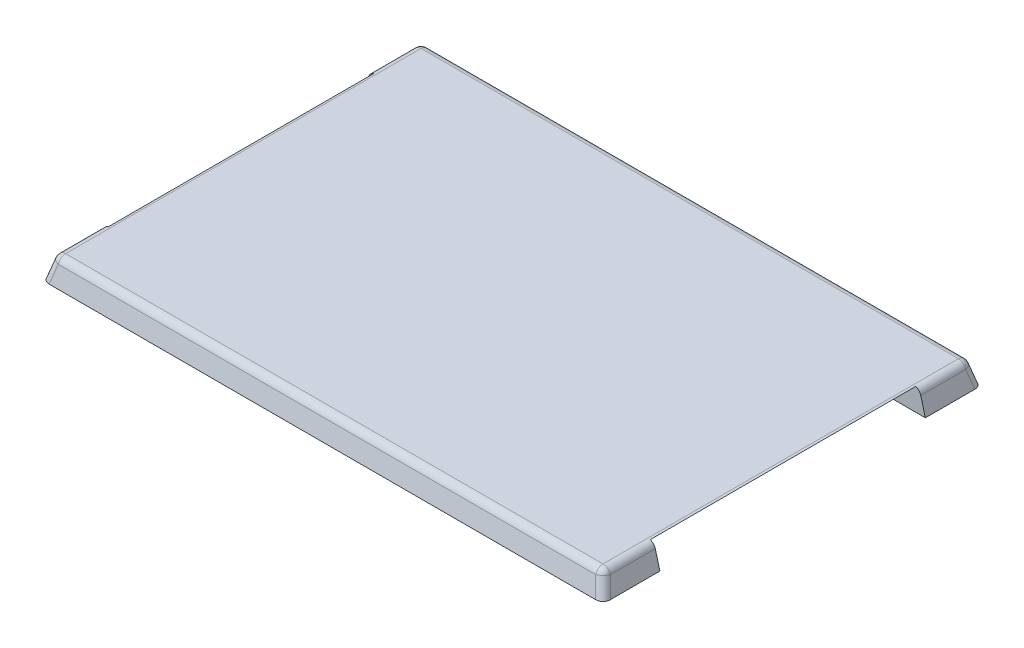
ISO-10303-21;
HEADER;
FILE_DESCRIPTION(('STEP AP214'),'2;1');
FILE_NAME('part.step','',(''),(''),'','','');
FILE_SCHEMA(('AUTOMOTIVE_DESIGN { 1 0 10303 214 1 1 1 1 }'));
ENDSEC;
DATA;
#1=APPLICATION_CONTEXT('core data for automotive mechanical design processes');
#2=APPLICATION_PROTOCOL_DEFINITION('international standard','automotive_design',2000,#1);
#3=PRODUCT_CONTEXT('',#1,'mechanical');
#4=PRODUCT('Part','Part','',(#3));
#5=PRODUCT_RELATED_PRODUCT_CATEGORY('part','',(#4));
#6=PRODUCT_DEFINITION_FORMATION('','',#4);
#7=PRODUCT_DEFINITION_CONTEXT('part definition',#1,'design');
#8=PRODUCT_DEFINITION('design','',#6,#7);
#9=PRODUCT_DEFINITION_SHAPE('','',#8);
#10=(LENGTH_UNIT() NAMED_UNIT(*) SI_UNIT(.MILLI.,.METRE.));
#11=(NAMED_UNIT(*) PLANE_ANGLE_UNIT() SI_UNIT($,.RADIAN.));
#12=(NAMED_UNIT(*) SI_UNIT($,.STERADIAN.) SOLID_ANGLE_UNIT());
#13=UNCERTAINTY_MEASURE_WITH_UNIT(LENGTH_MEASURE(1.E-05),#10,'distance_accuracy_value','');
#14=(GEOMETRIC_REPRESENTATION_CONTEXT(3) GLOBAL_UNCERTAINTY_ASSIGNED_CONTEXT((#13)) GLOBAL_UNIT_ASSIGNED_CONTEXT((#10,
#11,#12)) REPRESENTATION_CONTEXT('',''));
#15=CARTESIAN_POINT('',(0.,0.,0.));
#16=DIRECTION('',(0.,0.,1.));
#17=DIRECTION('',(1.,0.,0.));
#18=AXIS2_PLACEMENT_3D('',#15,#16,#17);
#19=CARTESIAN_POINT('',(3.5574121546408,0.105217202360702,-2.12499999999997));
#20=DIRECTION('',(0.624695047554425,-0.78086880944303,0.));
#21=DIRECTION('',(0.,0.,-1.));
#22=AXIS2_PLACEMENT_3D('',#19,#20,#21);
#23=PLANE('',#22);
#24=DIRECTION('',(0.78086880944303,0.624695047554425,0.));
#25=VECTOR('',#24,1.);
#26=CARTESIAN_POINT('',(3.5574121546408,0.105217202360702,-2.12499999999997));
#27=LINE('',#26,#25);
#28=CARTESIAN_POINT('',(3.42589065168992,0.,-2.12499999999997));
#29=VERTEX_POINT('',#28);
#30=CARTESIAN_POINT('',(3.5574121546408,0.105217202360702,-2.12499999999997));
#31=VERTEX_POINT('',#30);
#32=EDGE_CURVE('E302',#29,#31,#27,.T.);
#33=ORIENTED_EDGE('',*,*,#32,.T.);
#34=DIRECTION('',(0.,0.,1.));
#35=VECTOR('',#34,1.);
#36=CARTESIAN_POINT('',(3.5574121546408,0.105217202360702,-2.12499999999997));
#37=LINE('',#36,#35);
#38=CARTESIAN_POINT('',(3.5574121546408,0.105217202360714,-0.374999999999966));
#39=VERTEX_POINT('',#38);
#40=EDGE_CURVE('E11',#31,#39,#37,.T.);
#41=ORIENTED_EDGE('',*,*,#40,.T.);
#42=DIRECTION('',(0.78086880944303,0.624695047554425,0.));
#43=VECTOR('',#42,1.);
#44=CARTESIAN_POINT('',(3.5574121546408,0.105217202360714,-0.374999999999966));
#45=LINE('',#44,#43);
#46=CARTESIAN_POINT('',(3.4258906516899,0.,-0.374999999999965));
#47=VERTEX_POINT('',#46);
#48=EDGE_CURVE('E307',#47,#39,#45,.T.);
#49=ORIENTED_EDGE('',*,*,#48,.F.);
#50=DIRECTION('',(0.,0.,1.));
#51=VECTOR('',#50,1.);
#52=CARTESIAN_POINT('',(3.4258906516899,0.,0.));
#53=LINE('',#52,#51);
#54=EDGE_CURVE('E271',#29,#47,#53,.T.);
#55=ORIENTED_EDGE('',*,*,#54,.F.);
#56=EDGE_LOOP('',(#33,#41,#49,#55));
#57=FACE_BOUND('',#56,.T.);
#58=ADVANCED_FACE('F16',(#57),#23,.T.);
#59=CARTESIAN_POINT('',(3.7135859165294,-0.0900000000000547,-2.12499999999996));
#60=DIRECTION('',(0.,0.,1.));
#61=DIRECTION('',(-1.,0.,0.));
#62=AXIS2_PLACEMENT_3D('',#59,#60,#61);
#63=CYLINDRICAL_SURFACE('',#62,0.25);
#64=CARTESIAN_POINT('',(3.7135859165294,-0.0900000000000425,-0.374999999999965));
#65=DIRECTION('',(0.,0.,-1.));
#66=DIRECTION('',(-1.,0.,0.));
#67=AXIS2_PLACEMENT_3D('',#64,#65,#66);
#68=CIRCLE('',#67,0.25);
#69=CARTESIAN_POINT('',(3.63628006833615,0.147747357156923,-0.374999999999966));
#70=VERTEX_POINT('',#69);
#71=EDGE_CURVE('E24',#39,#70,#68,.T.);
#72=ORIENTED_EDGE('',*,*,#71,.F.);
#73=ORIENTED_EDGE('',*,*,#40,.F.);
#74=CARTESIAN_POINT('',(3.7135859165294,-0.0900000000000547,-2.12499999999996));
#75=DIRECTION('',(0.,0.,-1.));
#76=DIRECTION('',(-1.,0.,0.));
#77=AXIS2_PLACEMENT_3D('',#74,#75,#76);
#78=CIRCLE('',#77,0.25);
#79=CARTESIAN_POINT('',(3.63628006833617,0.147747357156917,-2.12499999999997));
#80=VERTEX_POINT('',#79);
#81=EDGE_CURVE('E306',#31,#80,#78,.T.);
#82=ORIENTED_EDGE('',*,*,#81,.T.);
#83=DIRECTION('',(0.,0.,-1.));
#84=VECTOR('',#83,1.);
#85=CARTESIAN_POINT('',(3.63628006833616,0.14774735715692,-1.24999999999997));
#86=LINE('',#85,#84);
#87=EDGE_CURVE('E259',#70,#80,#86,.T.);
#88=ORIENTED_EDGE('',*,*,#87,.F.);
#89=EDGE_LOOP('',(#72,#73,#82,#88));
#90=FACE_BOUND('',#89,.T.);
#91=ADVANCED_FACE('F458',(#90),#63,.F.);
#92=CARTESIAN_POINT('',(3.7135859165294,-0.0900000000000425,-0.374999999999965));
#93=DIRECTION('',(0.,0.,1.));
#94=DIRECTION('',(0.,-1.,0.));
#95=AXIS2_PLACEMENT_3D('',#92,#93,#94);
#96=PLANE('',#95);
#97=DIRECTION('',(-1.,0.,0.));
#98=VECTOR('',#97,1.);
#99=CARTESIAN_POINT('',(3.68507810593582,0.,-0.374999999999965));
#100=LINE('',#99,#98);
#101=CARTESIAN_POINT('',(3.7,0.,-0.374999999999965));
#102=VERTEX_POINT('',#101);
#103=EDGE_CURVE('E266',#102,#47,#100,.T.);
#104=ORIENTED_EDGE('',*,*,#103,.T.);
#105=ORIENTED_EDGE('',*,*,#48,.T.);
#106=ORIENTED_EDGE('',*,*,#71,.T.);
#107=CARTESIAN_POINT('',(3.62144127173638,0.1,-0.374999999999966));
#108=DIRECTION('',(0.,0.,-1.));
#109=DIRECTION('',(0.,-1.,0.));
#110=AXIS2_PLACEMENT_3D('',#107,#108,#109);
#111=CIRCLE('',#110,0.05);
#112=CARTESIAN_POINT('',(3.66973756305084,0.112940952255126,-0.374999999999966));
#113=VERTEX_POINT('',#112);
#114=EDGE_CURVE('E345',#70,#113,#111,.T.);
#115=ORIENTED_EDGE('',*,*,#114,.T.);
#116=DIRECTION('',(-0.258819045102521,0.965925826289068,0.));
#117=VECTOR('',#116,1.);
#118=CARTESIAN_POINT('',(3.7,0.,-0.374999999999965));
#119=LINE('',#118,#117);
#120=EDGE_CURVE('E361',#102,#113,#119,.T.);
#121=ORIENTED_EDGE('',*,*,#120,.F.);
#122=EDGE_LOOP('',(#104,#105,#106,#115,#121));
#123=FACE_BOUND('',#122,.T.);
#124=ADVANCED_FACE('F447',(#123),#96,.F.);
#125=CARTESIAN_POINT('',(3.7135859165294,-0.0900000000000547,-2.12499999999996));
#126=DIRECTION('',(0.,0.,1.));
#127=DIRECTION('',(0.,-1.,0.));
#128=AXIS2_PLACEMENT_3D('',#125,#126,#127);
#129=PLANE('',#128);
#130=DIRECTION('',(-1.,0.,0.));
#131=VECTOR('',#130,1.);
#132=CARTESIAN_POINT('',(3.68507810593582,0.,-2.12499999999997));
#133=LINE('',#132,#131);
#134=CARTESIAN_POINT('',(3.7,0.,-2.12499999999997));
#135=VERTEX_POINT('',#134);
#136=EDGE_CURVE('E292',#135,#29,#133,.T.);
#137=ORIENTED_EDGE('',*,*,#136,.F.);
#138=DIRECTION('',(-0.258819045102521,0.965925826289068,0.));
#139=VECTOR('',#138,1.);
#140=CARTESIAN_POINT('',(3.7,0.,-2.12499999999996));
#141=LINE('',#140,#139);
#142=CARTESIAN_POINT('',(3.66973756305084,0.112940952255126,-2.12499999999997));
#143=VERTEX_POINT('',#142);
#144=EDGE_CURVE('E253',#135,#143,#141,.T.);
#145=ORIENTED_EDGE('',*,*,#144,.T.);
#146=CARTESIAN_POINT('',(3.62144127173638,0.1,-2.12499999999997));
#147=DIRECTION('',(0.,0.,-1.));
#148=DIRECTION('',(0.,-1.,0.));
#149=AXIS2_PLACEMENT_3D('',#146,#147,#148);
#150=CIRCLE('',#149,0.05);
#151=EDGE_CURVE('E327',#80,#143,#150,.T.);
#152=ORIENTED_EDGE('',*,*,#151,.F.);
#153=ORIENTED_EDGE('',*,*,#81,.F.);
#154=ORIENTED_EDGE('',*,*,#32,.F.);
#155=EDGE_LOOP('',(#137,#145,#152,#153,#154));
#156=FACE_BOUND('',#155,.T.);
#157=ADVANCED_FACE('F454',(#156),#129,.T.);
#158=CARTESIAN_POINT('',(0.142587845359203,0.105217202360703,-2.12499999999997));
#159=DIRECTION('',(-0.624695047554425,-0.78086880944303,0.));
#160=DIRECTION('',(-0.78086880944303,0.624695047554425,0.));
#161=AXIS2_PLACEMENT_3D('',#158,#159,#160);
#162=PLANE('',#161);
#163=DIRECTION('',(0.78086880944303,-0.624695047554425,0.));
#164=VECTOR('',#163,1.);
#165=CARTESIAN_POINT('',(0.142587845359203,0.105217202360715,-0.374999999999966));
#166=LINE('',#165,#164);
#167=CARTESIAN_POINT('',(0.142587845359203,0.105217202360715,-0.374999999999966));
#168=VERTEX_POINT('',#167);
#169=CARTESIAN_POINT('',(0.274109348310097,0.,-0.374999999999965));
#170=VERTEX_POINT('',#169);
#171=EDGE_CURVE('E205',#168,#170,#166,.T.);
#172=ORIENTED_EDGE('',*,*,#171,.F.);
#173=DIRECTION('',(0.,0.,1.));
#174=VECTOR('',#173,1.);
#175=CARTESIAN_POINT('',(0.142587845359203,0.105217202360703,-2.12499999999997));
#176=LINE('',#175,#174);
#177=CARTESIAN_POINT('',(0.142587845359203,0.105217202360703,-2.12499999999997));
#178=VERTEX_POINT('',#177);
#179=EDGE_CURVE('E394',#178,#168,#176,.T.);
#180=ORIENTED_EDGE('',*,*,#179,.F.);
#181=DIRECTION('',(0.78086880944303,-0.624695047554425,0.));
#182=VECTOR('',#181,1.);
#183=CARTESIAN_POINT('',(0.142587845359203,0.105217202360703,-2.12499999999997));
#184=LINE('',#183,#182);
#185=CARTESIAN_POINT('',(0.274109348310082,0.,-2.12499999999997));
#186=VERTEX_POINT('',#185);
#187=EDGE_CURVE('E403',#178,#186,#184,.T.);
#188=ORIENTED_EDGE('',*,*,#187,.T.);
#189=DIRECTION('',(0.,0.,-1.));
#190=VECTOR('',#189,1.);
#191=CARTESIAN_POINT('',(0.2741093483101,0.,0.));
#192=LINE('',#191,#190);
#193=EDGE_CURVE('E210',#170,#186,#192,.T.);
#194=ORIENTED_EDGE('',*,*,#193,.F.);
#195=EDGE_LOOP('',(#172,#180,#188,#194));
#196=FACE_BOUND('',#195,.T.);
#197=ADVANCED_FACE('F487',(#196),#162,.T.);
#198=CARTESIAN_POINT('',(-0.0135859165294031,-0.0900000000000543,-2.12499999999996));
#199=DIRECTION('',(0.,0.,1.));
#200=DIRECTION('',(-1.,0.,0.));
#201=AXIS2_PLACEMENT_3D('',#198,#199,#200);
#202=CYLINDRICAL_SURFACE('',#201,0.25);
#203=CARTESIAN_POINT('',(-0.0135859165294031,-0.0900000000000543,-2.12499999999996));
#204=DIRECTION('',(0.,0.,-1.));
#205=DIRECTION('',(1.,0.,0.));
#206=AXIS2_PLACEMENT_3D('',#203,#204,#205);
#207=CIRCLE('',#206,0.25);
#208=CARTESIAN_POINT('',(0.0637199316638319,0.147747357156917,-2.12499999999997));
#209=VERTEX_POINT('',#208);
#210=EDGE_CURVE('E406',#209,#178,#207,.T.);
#211=ORIENTED_EDGE('',*,*,#210,.T.);
#212=ORIENTED_EDGE('',*,*,#179,.T.);
#213=CARTESIAN_POINT('',(-0.0135859165294031,-0.0900000000000421,-0.374999999999965));
#214=DIRECTION('',(0.,0.,-1.));
#215=DIRECTION('',(1.,0.,0.));
#216=AXIS2_PLACEMENT_3D('',#213,#214,#215);
#217=CIRCLE('',#216,0.25);
#218=CARTESIAN_POINT('',(0.0637199316638511,0.147747357156923,-0.374999999999966));
#219=VERTEX_POINT('',#218);
#220=EDGE_CURVE('E436',#219,#168,#217,.T.);
#221=ORIENTED_EDGE('',*,*,#220,.F.);
#222=DIRECTION('',(0.,0.,1.));
#223=VECTOR('',#222,1.);
#224=CARTESIAN_POINT('',(0.0637199316638412,0.14774735715692,-1.24999999999997));
#225=LINE('',#224,#223);
#226=EDGE_CURVE('E417',#209,#219,#225,.T.);
#227=ORIENTED_EDGE('',*,*,#226,.F.);
#228=EDGE_LOOP('',(#211,#212,#221,#227));
#229=FACE_BOUND('',#228,.T.);
#230=ADVANCED_FACE('F486',(#229),#202,.F.);
#231=CARTESIAN_POINT('',(-0.0135859165294031,-0.0900000000000421,-0.374999999999965));
#232=DIRECTION('',(0.,0.,-1.));
#233=DIRECTION('',(0.,-1.,0.));
#234=AXIS2_PLACEMENT_3D('',#231,#232,#233);
#235=PLANE('',#234);
#236=DIRECTION('',(-1.,0.,0.));
#237=VECTOR('',#236,1.);
#238=CARTESIAN_POINT('',(0.0149218940641788,0.,-0.374999999999965));
#239=LINE('',#238,#237);
#240=CARTESIAN_POINT('',(0.,0.,-0.374999999999965));
#241=VERTEX_POINT('',#240);
#242=EDGE_CURVE('E192',#170,#241,#239,.T.);
#243=ORIENTED_EDGE('',*,*,#242,.T.);
#244=DIRECTION('',(0.258819045102521,0.965925826289068,0.));
#245=VECTOR('',#244,1.);
#246=CARTESIAN_POINT('',(0.,0.,-0.374999999999965));
#247=LINE('',#246,#245);
#248=CARTESIAN_POINT('',(0.0302624369491631,0.112940952255126,-0.374999999999966));
#249=VERTEX_POINT('',#248);
#250=EDGE_CURVE('E200',#241,#249,#247,.T.);
#251=ORIENTED_EDGE('',*,*,#250,.T.);
#252=CARTESIAN_POINT('',(0.0785587282636165,0.1,-0.374999999999966));
#253=DIRECTION('',(0.,0.,1.));
#254=DIRECTION('',(0.,1.,0.));
#255=AXIS2_PLACEMENT_3D('',#252,#253,#254);
#256=CIRCLE('',#255,0.05);
#257=EDGE_CURVE('E423',#219,#249,#256,.T.);
#258=ORIENTED_EDGE('',*,*,#257,.F.);
#259=ORIENTED_EDGE('',*,*,#220,.T.);
#260=ORIENTED_EDGE('',*,*,#171,.T.);
#261=EDGE_LOOP('',(#243,#251,#258,#259,#260));
#262=FACE_BOUND('',#261,.T.);
#263=ADVANCED_FACE('F198',(#262),#235,.T.);
#264=CARTESIAN_POINT('',(-0.0135859165294031,-0.0900000000000543,-2.12499999999996));
#265=DIRECTION('',(0.,0.,-1.));
#266=DIRECTION('',(0.,-1.,0.));
#267=AXIS2_PLACEMENT_3D('',#264,#265,#266);
#268=PLANE('',#267);
#269=DIRECTION('',(1.,0.,0.));
#270=VECTOR('',#269,1.);
#271=CARTESIAN_POINT('',(0.,0.,-2.12499999999996));
#272=LINE('',#271,#270);
#273=CARTESIAN_POINT('',(0.,0.,-2.12499999999997));
#274=VERTEX_POINT('',#273);
#275=EDGE_CURVE('E280',#274,#186,#272,.T.);
#276=ORIENTED_EDGE('',*,*,#275,.T.);
#277=ORIENTED_EDGE('',*,*,#187,.F.);
#278=ORIENTED_EDGE('',*,*,#210,.F.);
#279=CARTESIAN_POINT('',(0.0785587282636165,0.1,-2.12499999999997));
#280=DIRECTION('',(0.,0.,1.));
#281=DIRECTION('',(0.,1.,0.));
#282=AXIS2_PLACEMENT_3D('',#279,#280,#281);
#283=CIRCLE('',#282,0.05);
#284=CARTESIAN_POINT('',(0.0302624369491631,0.112940952255126,-2.12499999999997));
#285=VERTEX_POINT('',#284);
#286=EDGE_CURVE('E287',#209,#285,#283,.T.);
#287=ORIENTED_EDGE('',*,*,#286,.T.);
#288=DIRECTION('',(0.258819045102521,0.965925826289068,0.));
#289=VECTOR('',#288,1.);
#290=CARTESIAN_POINT('',(0.,0.,-2.12499999999996));
#291=LINE('',#290,#289);
#292=EDGE_CURVE('E243',#274,#285,#291,.T.);
#293=ORIENTED_EDGE('',*,*,#292,.F.);
#294=EDGE_LOOP('',(#276,#277,#278,#287,#293));
#295=FACE_BOUND('',#294,.T.);
#296=ADVANCED_FACE('F495',(#295),#268,.F.);
#297=CARTESIAN_POINT('',(0.,0.1,-2.42144127173638));
#298=DIRECTION('',(1.,0.,0.));
#299=DIRECTION('',(0.,0.,-1.));
#300=AXIS2_PLACEMENT_3D('',#297,#298,#299);
#301=CYLINDRICAL_SURFACE('',#300,0.05);
#302=CARTESIAN_POINT('',(3.62144127173638,0.1,-2.42144127173638));
#303=DIRECTION('',(-1.,0.,0.));
#304=DIRECTION('',(0.,0.,-1.));
#305=AXIS2_PLACEMENT_3D('',#302,#303,#304);
#306=CIRCLE('',#305,0.05);
#307=CARTESIAN_POINT('',(3.62144127173638,0.15,-2.42144127173638));
#308=VERTEX_POINT('',#307);
#309=CARTESIAN_POINT('',(3.62144127173638,0.112940952255126,-2.46973756305084));
#310=VERTEX_POINT('',#309);
#311=EDGE_CURVE('E428',#308,#310,#306,.T.);
#312=ORIENTED_EDGE('',*,*,#311,.T.);
#313=DIRECTION('',(1.,0.,0.));
#314=VECTOR('',#313,1.);
#315=CARTESIAN_POINT('',(0.,0.112940952255126,-2.46973756305084));
#316=LINE('',#315,#314);
#317=CARTESIAN_POINT('',(0.0785587282636165,0.112940952255126,-2.46973756305084));
#318=VERTEX_POINT('',#317);
#319=EDGE_CURVE('E379',#318,#310,#316,.T.);
#320=ORIENTED_EDGE('',*,*,#319,.F.);
#321=CARTESIAN_POINT('',(0.0785587282636165,0.1,-2.42144127173638));
#322=DIRECTION('',(1.,0.,0.));
#323=DIRECTION('',(0.,0.,1.));
#324=AXIS2_PLACEMENT_3D('',#321,#322,#323);
#325=CIRCLE('',#324,0.05);
#326=CARTESIAN_POINT('',(0.0785587282636165,0.15,-2.42144127173638));
#327=VERTEX_POINT('',#326);
#328=EDGE_CURVE('E410',#318,#327,#325,.T.);
#329=ORIENTED_EDGE('',*,*,#328,.T.);
#330=DIRECTION('',(-1.,0.,0.));
#331=VECTOR('',#330,1.);
#332=CARTESIAN_POINT('',(0.,0.15,-2.42144127173638));
#333=LINE('',#332,#331);
#334=EDGE_CURVE('E377',#308,#327,#333,.T.);
#335=ORIENTED_EDGE('',*,*,#334,.F.);
#336=EDGE_LOOP('',(#312,#320,#329,#335));
#337=FACE_BOUND('',#336,.T.);
#338=ADVANCED_FACE('F517',(#337),#301,.T.);
#339=CARTESIAN_POINT('',(0.0785587282636165,0.1,-2.42144127173638));
#340=DIRECTION('',(0.,1.,0.));
#341=DIRECTION('',(1.,0.,0.));
#342=AXIS2_PLACEMENT_3D('',#339,#340,#341);
#343=SPHERICAL_SURFACE('',#342,0.05);
#344=CARTESIAN_POINT('',(0.0785587282636165,0.1,-2.42144127173638));
#345=DIRECTION('',(0.250562807085732,0.935113126531029,0.250562807085732));
#346=DIRECTION('',(0.,-0.258819045102522,0.965925826289068));
#347=AXIS2_PLACEMENT_3D('',#344,#345,#346);
#348=CIRCLE('',#347,0.05);
#349=CARTESIAN_POINT('',(0.0302624369491631,0.112940952255126,-2.42144127173638));
#350=VERTEX_POINT('',#349);
#351=EDGE_CURVE('E233',#318,#350,#348,.T.);
#352=ORIENTED_EDGE('',*,*,#351,.T.);
#353=CARTESIAN_POINT('',(0.0785587282636165,0.1,-2.42144127173638));
#354=DIRECTION('',(0.,0.,-1.));
#355=DIRECTION('',(-1.,0.,0.));
#356=AXIS2_PLACEMENT_3D('',#353,#354,#355);
#357=CIRCLE('',#356,0.05);
#358=EDGE_CURVE('E424',#350,#327,#357,.T.);
#359=ORIENTED_EDGE('',*,*,#358,.T.);
#360=ORIENTED_EDGE('',*,*,#328,.F.);
#361=EDGE_LOOP('',(#352,#359,#360));
#362=FACE_BOUND('',#361,.T.);
#363=ADVANCED_FACE('F551',(#362),#343,.T.);
#364=CARTESIAN_POINT('',(3.62144127173638,0.1,-2.42144127173638));
#365=DIRECTION('',(0.,1.,0.));
#366=DIRECTION('',(1.,0.,0.));
#367=AXIS2_PLACEMENT_3D('',#364,#365,#366);
#368=SPHERICAL_SURFACE('',#367,0.05);
#369=CARTESIAN_POINT('',(3.62144127173638,0.1,-2.42144127173638));
#370=DIRECTION('',(0.,0.,-1.));
#371=DIRECTION('',(-1.,0.,0.));
#372=AXIS2_PLACEMENT_3D('',#369,#370,#371);
#373=CIRCLE('',#372,0.05);
#374=CARTESIAN_POINT('',(3.66973756305084,0.112940952255126,-2.42144127173638));
#375=VERTEX_POINT('',#374);
#376=EDGE_CURVE('E332',#308,#375,#373,.T.);
#377=ORIENTED_EDGE('',*,*,#376,.T.);
#378=CARTESIAN_POINT('',(3.62144127173638,0.1,-2.42144127173638));
#379=DIRECTION('',(-0.250562807085733,0.93511312653103,0.25056280708573));
#380=DIRECTION('',(-0.965925826289068,-0.258819045102522,0.));
#381=AXIS2_PLACEMENT_3D('',#378,#379,#380);
#382=CIRCLE('',#381,0.05);
#383=EDGE_CURVE('E285',#375,#310,#382,.T.);
#384=ORIENTED_EDGE('',*,*,#383,.T.);
#385=ORIENTED_EDGE('',*,*,#311,.F.);
#386=EDGE_LOOP('',(#377,#384,#385));
#387=FACE_BOUND('',#386,.T.);
#388=ADVANCED_FACE('F514',(#387),#368,.T.);
#389=CARTESIAN_POINT('',(0.202218467798583,0.561504430795229,-2.29778153220142));
#390=DIRECTION('',(-0.250562807085732,-0.935113126531029,-0.250562807085731));
#391=DIRECTION('',(0.,0.258819045102521,-0.965925826289068));
#392=AXIS2_PLACEMENT_3D('',#389,#390,#391);
#393=CYLINDRICAL_SURFACE('',#392,0.05);
#394=CARTESIAN_POINT('',(0.0517638090204955,0.,-2.4482361909795));
#395=DIRECTION('',(0.,-1.,0.));
#396=DIRECTION('',(-0.707106781186548,0.,-0.707106781186548));
#397=AXIS2_PLACEMENT_3D('',#394,#395,#396);
#398=ELLIPSE('',#397,0.053469466507729,0.0499999999999952);
#399=CARTESIAN_POINT('',(0.,0.,-2.45170370868555));
#400=VERTEX_POINT('',#399);
#401=CARTESIAN_POINT('',(0.0482962913144535,0.,-2.5));
#402=VERTEX_POINT('',#401);
#403=EDGE_CURVE('E277',#400,#402,#398,.T.);
#404=ORIENTED_EDGE('',*,*,#403,.F.);
#405=DIRECTION('',(-0.250562807085732,-0.935113126531029,-0.250562807085732));
#406=VECTOR('',#405,1.);
#407=CARTESIAN_POINT('',(0.15392217648413,0.574445383050355,-2.29778153220142));
#408=LINE('',#407,#406);
#409=EDGE_CURVE('E242',#350,#400,#408,.T.);
#410=ORIENTED_EDGE('',*,*,#409,.F.);
#411=ORIENTED_EDGE('',*,*,#351,.F.);
#412=DIRECTION('',(0.250562807085732,0.935113126531029,0.250562807085732));
#413=VECTOR('',#412,1.);
#414=CARTESIAN_POINT('',(0.045264167061879,-0.0113160417654698,-2.50303212425258));
#415=LINE('',#414,#413);
#416=EDGE_CURVE('E374',#402,#318,#415,.T.);
#417=ORIENTED_EDGE('',*,*,#416,.F.);
#418=EDGE_LOOP('',(#404,#410,#411,#417));
#419=FACE_BOUND('',#418,.T.);
#420=ADVANCED_FACE('F498',(#419),#393,.T.);
#421=CARTESIAN_POINT('',(0.0785587282636165,0.1,0.));
#422=DIRECTION('',(0.,0.,-1.));
#423=DIRECTION('',(-1.,0.,0.));
#424=AXIS2_PLACEMENT_3D('',#421,#422,#423);
#425=CYLINDRICAL_SURFACE('',#424,0.05);
#426=ORIENTED_EDGE('',*,*,#286,.F.);
#427=ORIENTED_EDGE('',*,*,#226,.T.);
#428=ORIENTED_EDGE('',*,*,#257,.T.);
#429=DIRECTION('',(0.,0.,-1.));
#430=VECTOR('',#429,1.);
#431=CARTESIAN_POINT('',(0.0302624369491631,0.112940952255126,0.));
#432=LINE('',#431,#430);
#433=CARTESIAN_POINT('',(0.0302624369491631,0.112940952255126,-0.0785587282636165));
#434=VERTEX_POINT('',#433);
#435=EDGE_CURVE('E223',#434,#249,#432,.T.);
#436=ORIENTED_EDGE('',*,*,#435,.F.);
#437=CARTESIAN_POINT('',(0.0785587282636165,0.1,-0.0785587282636165));
#438=DIRECTION('',(0.,0.,-1.));
#439=DIRECTION('',(1.,0.,0.));
#440=AXIS2_PLACEMENT_3D('',#437,#438,#439);
#441=CIRCLE('',#440,0.05);
#442=CARTESIAN_POINT('',(0.0785587282636165,0.15,-0.0785587282636165));
#443=VERTEX_POINT('',#442);
#444=EDGE_CURVE('E289',#434,#443,#441,.T.);
#445=ORIENTED_EDGE('',*,*,#444,.T.);
#446=DIRECTION('',(0.,0.,1.));
#447=VECTOR('',#446,1.);
#448=CARTESIAN_POINT('',(0.0785587282636165,0.15,0.));
#449=LINE('',#448,#447);
#450=EDGE_CURVE('E237',#327,#443,#449,.T.);
#451=ORIENTED_EDGE('',*,*,#450,.F.);
#452=ORIENTED_EDGE('',*,*,#358,.F.);
#453=DIRECTION('',(0.,0.,-1.));
#454=VECTOR('',#453,1.);
#455=CARTESIAN_POINT('',(0.0302624369491631,0.112940952255126,0.));
#456=LINE('',#455,#454);
#457=EDGE_CURVE('E239',#285,#350,#456,.T.);
#458=ORIENTED_EDGE('',*,*,#457,.F.);
#459=EDGE_LOOP('',(#426,#427,#428,#436,#445,#451,#452,#458));
#460=FACE_BOUND('',#459,.T.);
#461=ADVANCED_FACE('F485',(#460),#425,.T.);
#462=CARTESIAN_POINT('',(3.4224434678478,0.842669914706825,-2.2224434678478));
#463=DIRECTION('',(0.250562807085732,-0.935113126531029,-0.250562807085731));
#464=DIRECTION('',(0.,0.258819045102521,-0.965925826289068));
#465=AXIS2_PLACEMENT_3D('',#462,#463,#464);
#466=CYLINDRICAL_SURFACE('',#465,0.05);
#467=CARTESIAN_POINT('',(3.64823619097944,0.,-2.44823619097944));
#468=DIRECTION('',(0.,-1.,0.));
#469=DIRECTION('',(0.707106781186548,0.,-0.707106781186548));
#470=AXIS2_PLACEMENT_3D('',#467,#468,#469);
#471=ELLIPSE('',#470,0.0534694665078228,0.050000000000032);
#472=CARTESIAN_POINT('',(3.65170370868555,0.,-2.5));
#473=VERTEX_POINT('',#472);
#474=CARTESIAN_POINT('',(3.7,0.,-2.45170370868555));
#475=VERTEX_POINT('',#474);
#476=EDGE_CURVE('E301',#473,#475,#471,.T.);
#477=ORIENTED_EDGE('',*,*,#476,.F.);
#478=DIRECTION('',(0.250562807085732,-0.935113126531029,-0.250562807085732));
#479=VECTOR('',#478,1.);
#480=CARTESIAN_POINT('',(3.4224434678478,0.855610866961952,-2.27073975916225));
#481=LINE('',#480,#479);
#482=EDGE_CURVE('E376',#310,#473,#481,.T.);
#483=ORIENTED_EDGE('',*,*,#482,.F.);
#484=ORIENTED_EDGE('',*,*,#383,.F.);
#485=DIRECTION('',(-0.250562807085732,0.935113126531029,0.250562807085732));
#486=VECTOR('',#485,1.);
#487=CARTESIAN_POINT('',(3.54607782351587,0.574445383050355,-2.29778153220142));
#488=LINE('',#487,#486);
#489=EDGE_CURVE('E249',#475,#375,#488,.T.);
#490=ORIENTED_EDGE('',*,*,#489,.F.);
#491=EDGE_LOOP('',(#477,#483,#484,#490));
#492=FACE_BOUND('',#491,.T.);
#493=ADVANCED_FACE('F507',(#492),#466,.T.);
#494=CARTESIAN_POINT('',(0.0785587282636165,0.1,-0.0785587282636165));
#495=DIRECTION('',(0.,1.,0.));
#496=DIRECTION('',(1.,0.,0.));
#497=AXIS2_PLACEMENT_3D('',#494,#495,#496);
#498=SPHERICAL_SURFACE('',#497,0.05);
#499=CARTESIAN_POINT('',(0.0785587282636165,0.1,-0.0785587282636165));
#500=DIRECTION('',(0.250562807085732,0.935113126531029,-0.250562807085732));
#501=DIRECTION('',(-0.965925826289068,0.258819045102521,0.));
#502=AXIS2_PLACEMENT_3D('',#499,#500,#501);
#503=CIRCLE('',#502,0.05);
#504=CARTESIAN_POINT('',(0.0785587282636165,0.112940952255126,-0.0302624369491631));
#505=VERTEX_POINT('',#504);
#506=EDGE_CURVE('E409',#434,#505,#503,.T.);
#507=ORIENTED_EDGE('',*,*,#506,.T.);
#508=CARTESIAN_POINT('',(0.0785587282636165,0.1,-0.0785587282636165));
#509=DIRECTION('',(-1.,0.,0.));
#510=DIRECTION('',(0.,0.,1.));
#511=AXIS2_PLACEMENT_3D('',#508,#509,#510);
#512=CIRCLE('',#511,0.05);
#513=EDGE_CURVE('E398',#505,#443,#512,.T.);
#514=ORIENTED_EDGE('',*,*,#513,.T.);
#515=ORIENTED_EDGE('',*,*,#444,.F.);
#516=EDGE_LOOP('',(#507,#514,#515));
#517=FACE_BOUND('',#516,.T.);
#518=ADVANCED_FACE('F527',(#517),#498,.T.);
#519=CARTESIAN_POINT('',(3.62144127173638,0.1,-0.0785587282636165));
#520=DIRECTION('',(0.,1.,0.));
#521=DIRECTION('',(1.,0.,0.));
#522=AXIS2_PLACEMENT_3D('',#519,#520,#521);
#523=SPHERICAL_SURFACE('',#522,0.05);
#524=CARTESIAN_POINT('',(3.62144127173638,0.1,-0.0785587282636165));
#525=DIRECTION('',(1.,0.,0.));
#526=DIRECTION('',(0.,0.,-1.));
#527=AXIS2_PLACEMENT_3D('',#524,#525,#526);
#528=CIRCLE('',#527,0.05);
#529=CARTESIAN_POINT('',(3.62144127173638,0.15,-0.0785587282636165));
#530=VERTEX_POINT('',#529);
#531=CARTESIAN_POINT('',(3.62144127173638,0.112940952255126,-0.0302624369491631));
#532=VERTEX_POINT('',#531);
#533=EDGE_CURVE('E401',#530,#532,#528,.T.);
#534=ORIENTED_EDGE('',*,*,#533,.T.);
#535=CARTESIAN_POINT('',(3.62144127173638,0.1,-0.0785587282636165));
#536=DIRECTION('',(-0.250562807085731,0.93511312653103,-0.250562807085732));
#537=DIRECTION('',(0.,0.258819045102521,0.965925826289068));
#538=AXIS2_PLACEMENT_3D('',#535,#536,#537);
#539=CIRCLE('',#538,0.05);
#540=CARTESIAN_POINT('',(3.66973756305084,0.112940952255126,-0.0785587282636165));
#541=VERTEX_POINT('',#540);
#542=EDGE_CURVE('E238',#532,#541,#539,.T.);
#543=ORIENTED_EDGE('',*,*,#542,.T.);
#544=CARTESIAN_POINT('',(3.62144127173638,0.1,-0.0785587282636165));
#545=DIRECTION('',(0.,0.,-1.));
#546=DIRECTION('',(0.,-1.,0.));
#547=AXIS2_PLACEMENT_3D('',#544,#545,#546);
#548=CIRCLE('',#547,0.05);
#549=EDGE_CURVE('E341',#530,#541,#548,.T.);
#550=ORIENTED_EDGE('',*,*,#549,.F.);
#551=EDGE_LOOP('',(#534,#543,#550));
#552=FACE_BOUND('',#551,.T.);
#553=ADVANCED_FACE('F524',(#552),#523,.T.);
#554=CARTESIAN_POINT('',(0.0452641670618789,-0.0242569940205958,-0.0452641670618789));
#555=DIRECTION('',(-0.250562807085732,-0.935113126531029,0.250562807085732));
#556=DIRECTION('',(0.,-0.258819045102521,-0.965925826289068));
#557=AXIS2_PLACEMENT_3D('',#554,#555,#556);
#558=CYLINDRICAL_SURFACE('',#557,0.05);
#559=CARTESIAN_POINT('',(0.0517638090205043,0.,-0.0517638090205043));
#560=DIRECTION('',(0.,-1.,0.));
#561=DIRECTION('',(0.707106781186548,0.,-0.707106781186548));
#562=AXIS2_PLACEMENT_3D('',#559,#560,#561);
#563=ELLIPSE('',#562,0.0534694665077414,0.05);
#564=CARTESIAN_POINT('',(0.0482962913144534,0.,0.));
#565=VERTEX_POINT('',#564);
#566=CARTESIAN_POINT('',(0.,0.,-0.0482962913144534));
#567=VERTEX_POINT('',#566);
#568=EDGE_CURVE('E208',#565,#567,#563,.T.);
#569=ORIENTED_EDGE('',*,*,#568,.F.);
#570=DIRECTION('',(-0.250562807085732,-0.935113126531029,0.250562807085732));
#571=VECTOR('',#570,1.);
#572=CARTESIAN_POINT('',(0.0452641670618789,-0.0113160417654698,0.00303212425257448));
#573=LINE('',#572,#571);
#574=EDGE_CURVE('E370',#505,#565,#573,.T.);
#575=ORIENTED_EDGE('',*,*,#574,.F.);
#576=ORIENTED_EDGE('',*,*,#506,.F.);
#577=DIRECTION('',(0.250562807085732,0.935113126531029,-0.250562807085732));
#578=VECTOR('',#577,1.);
#579=CARTESIAN_POINT('',(-0.00303212425257449,-0.0113160417654698,-0.0452641670618789));
#580=LINE('',#579,#578);
#581=EDGE_CURVE('E219',#567,#434,#580,.T.);
#582=ORIENTED_EDGE('',*,*,#581,.F.);
#583=EDGE_LOOP('',(#569,#575,#576,#582));
#584=FACE_BOUND('',#583,.T.);
#585=ADVANCED_FACE('F480',(#584),#558,.T.);
#586=CARTESIAN_POINT('',(0.,0.1,-0.0785587282636165));
#587=DIRECTION('',(-1.,0.,0.));
#588=DIRECTION('',(0.,0.,1.));
#589=AXIS2_PLACEMENT_3D('',#586,#587,#588);
#590=CYLINDRICAL_SURFACE('',#589,0.05);
#591=ORIENTED_EDGE('',*,*,#513,.F.);
#592=DIRECTION('',(-1.,0.,0.));
#593=VECTOR('',#592,1.);
#594=CARTESIAN_POINT('',(0.,0.112940952255126,-0.0302624369491631));
#595=LINE('',#594,#593);
#596=EDGE_CURVE('E362',#532,#505,#595,.T.);
#597=ORIENTED_EDGE('',*,*,#596,.F.);
#598=ORIENTED_EDGE('',*,*,#533,.F.);
#599=DIRECTION('',(1.,0.,0.));
#600=VECTOR('',#599,1.);
#601=CARTESIAN_POINT('',(0.,0.15,-0.0785587282636165));
#602=LINE('',#601,#600);
#603=EDGE_CURVE('E232',#443,#530,#602,.T.);
#604=ORIENTED_EDGE('',*,*,#603,.F.);
#605=EDGE_LOOP('',(#591,#597,#598,#604));
#606=FACE_BOUND('',#605,.T.);
#607=ADVANCED_FACE('F528',(#606),#590,.T.);
#608=CARTESIAN_POINT('',(3.65473583293812,-0.0242569940205958,-0.0452641670618789));
#609=DIRECTION('',(0.250562807085732,-0.935113126531029,0.250562807085732));
#610=DIRECTION('',(0.,-0.258819045102521,-0.965925826289068));
#611=AXIS2_PLACEMENT_3D('',#608,#609,#610);
#612=CYLINDRICAL_SURFACE('',#611,0.05);
#613=CARTESIAN_POINT('',(3.64823619097952,0.,-0.0517638090204786));
#614=DIRECTION('',(0.,-1.,0.));
#615=DIRECTION('',(-0.707106781186548,0.,-0.707106781186548));
#616=AXIS2_PLACEMENT_3D('',#613,#614,#615);
#617=ELLIPSE('',#616,0.0534694665077064,0.0499999999999843);
#618=CARTESIAN_POINT('',(3.7,0.,-0.0482962913144534));
#619=VERTEX_POINT('',#618);
#620=CARTESIAN_POINT('',(3.65170370868555,0.,0.));
#621=VERTEX_POINT('',#620);
#622=EDGE_CURVE('E312',#619,#621,#617,.T.);
#623=ORIENTED_EDGE('',*,*,#622,.F.);
#624=DIRECTION('',(0.250562807085732,-0.935113126531029,0.250562807085732));
#625=VECTOR('',#624,1.);
#626=CARTESIAN_POINT('',(3.70303212425257,-0.0113160417654698,-0.0452641670618789));
#627=LINE('',#626,#625);
#628=EDGE_CURVE('E368',#541,#619,#627,.T.);
#629=ORIENTED_EDGE('',*,*,#628,.F.);
#630=ORIENTED_EDGE('',*,*,#542,.F.);
#631=DIRECTION('',(-0.250562807085732,0.935113126531029,-0.250562807085732));
#632=VECTOR('',#631,1.);
#633=CARTESIAN_POINT('',(3.4224434678478,0.855610866961951,-0.229260240837748));
#634=LINE('',#633,#632);
#635=EDGE_CURVE('E358',#621,#532,#634,.T.);
#636=ORIENTED_EDGE('',*,*,#635,.F.);
#637=EDGE_LOOP('',(#623,#629,#630,#636));
#638=FACE_BOUND('',#637,.T.);
#639=ADVANCED_FACE('F467',(#638),#612,.T.);
#640=CARTESIAN_POINT('',(0.,0.15,0.));
#641=DIRECTION('',(0.,-1.,0.));
#642=DIRECTION('',(0.,0.,-1.));
#643=AXIS2_PLACEMENT_3D('',#640,#641,#642);
#644=PLANE('',#643);
#645=DIRECTION('',(0.,0.,-1.));
#646=VECTOR('',#645,1.);
#647=CARTESIAN_POINT('',(3.62144127173638,0.15,0.));
#648=LINE('',#647,#646);
#649=EDGE_CURVE('E337',#530,#308,#648,.T.);
#650=ORIENTED_EDGE('',*,*,#649,.T.);
#651=ORIENTED_EDGE('',*,*,#334,.T.);
#652=ORIENTED_EDGE('',*,*,#450,.T.);
#653=ORIENTED_EDGE('',*,*,#603,.T.);
#654=EDGE_LOOP('',(#650,#651,#652,#653));
#655=FACE_BOUND('',#654,.T.);
#656=ADVANCED_FACE('F519',(#655),#644,.F.);
#657=CARTESIAN_POINT('',(0.,0.,-2.5));
#658=DIRECTION('',(0.,0.258819045102521,-0.965925826289068));
#659=DIRECTION('',(-1.,0.,0.));
#660=AXIS2_PLACEMENT_3D('',#657,#658,#659);
#661=PLANE('',#660);
#662=DIRECTION('',(-1.,0.,0.));
#663=VECTOR('',#662,1.);
#664=CARTESIAN_POINT('',(0.,0.,-2.5));
#665=LINE('',#664,#663);
#666=EDGE_CURVE('E281',#473,#402,#665,.T.);
#667=ORIENTED_EDGE('',*,*,#666,.T.);
#668=ORIENTED_EDGE('',*,*,#416,.T.);
#669=ORIENTED_EDGE('',*,*,#319,.T.);
#670=ORIENTED_EDGE('',*,*,#482,.T.);
#671=EDGE_LOOP('',(#667,#668,#669,#670));
#672=FACE_BOUND('',#671,.T.);
#673=ADVANCED_FACE('F503',(#672),#661,.T.);
#674=CARTESIAN_POINT('',(3.7,0.,0.));
#675=DIRECTION('',(0.965925826289068,0.258819045102521,0.));
#676=DIRECTION('',(0.,0.,-1.));
#677=AXIS2_PLACEMENT_3D('',#674,#675,#676);
#678=PLANE('',#677);
#679=DIRECTION('',(0.,0.,-1.));
#680=VECTOR('',#679,1.);
#681=CARTESIAN_POINT('',(3.7,0.,0.));
#682=LINE('',#681,#680);
#683=EDGE_CURVE('E269',#619,#102,#682,.T.);
#684=ORIENTED_EDGE('',*,*,#683,.T.);
#685=ORIENTED_EDGE('',*,*,#120,.T.);
#686=DIRECTION('',(0.,0.,1.));
#687=VECTOR('',#686,1.);
#688=CARTESIAN_POINT('',(3.66973756305084,0.112940952255126,0.));
#689=LINE('',#688,#687);
#690=EDGE_CURVE('E350',#113,#541,#689,.T.);
#691=ORIENTED_EDGE('',*,*,#690,.T.);
#692=ORIENTED_EDGE('',*,*,#628,.T.);
#693=EDGE_LOOP('',(#684,#685,#691,#692));
#694=FACE_BOUND('',#693,.T.);
#695=ADVANCED_FACE('F464',(#694),#678,.T.);
#696=CARTESIAN_POINT('',(0.,0.,0.));
#697=DIRECTION('',(0.,0.258819045102521,0.965925826289068));
#698=DIRECTION('',(1.,0.,0.));
#699=AXIS2_PLACEMENT_3D('',#696,#697,#698);
#700=PLANE('',#699);
#701=DIRECTION('',(1.,0.,0.));
#702=VECTOR('',#701,1.);
#703=CARTESIAN_POINT('',(0.,0.,0.));
#704=LINE('',#703,#702);
#705=EDGE_CURVE('E317',#565,#621,#704,.T.);
#706=ORIENTED_EDGE('',*,*,#705,.T.);
#707=ORIENTED_EDGE('',*,*,#635,.T.);
#708=ORIENTED_EDGE('',*,*,#596,.T.);
#709=ORIENTED_EDGE('',*,*,#574,.T.);
#710=EDGE_LOOP('',(#706,#707,#708,#709));
#711=FACE_BOUND('',#710,.T.);
#712=ADVANCED_FACE('F471',(#711),#700,.T.);
#713=CARTESIAN_POINT('',(0.,0.,0.));
#714=DIRECTION('',(-0.965925826289068,0.258819045102521,0.));
#715=DIRECTION('',(0.,0.,1.));
#716=AXIS2_PLACEMENT_3D('',#713,#714,#715);
#717=PLANE('',#716);
#718=DIRECTION('',(0.,0.,1.));
#719=VECTOR('',#718,1.);
#720=CARTESIAN_POINT('',(0.,0.,0.));
#721=LINE('',#720,#719);
#722=EDGE_CURVE('E275',#400,#274,#721,.T.);
#723=ORIENTED_EDGE('',*,*,#722,.T.);
#724=ORIENTED_EDGE('',*,*,#292,.T.);
#725=ORIENTED_EDGE('',*,*,#457,.T.);
#726=ORIENTED_EDGE('',*,*,#409,.T.);
#727=EDGE_LOOP('',(#723,#724,#725,#726));
#728=FACE_BOUND('',#727,.T.);
#729=ADVANCED_FACE('F494',(#728),#717,.T.);
#730=CARTESIAN_POINT('',(3.62144127173638,0.1,0.));
#731=DIRECTION('',(0.,0.,1.));
#732=DIRECTION('',(1.,0.,0.));
#733=AXIS2_PLACEMENT_3D('',#730,#731,#732);
#734=CYLINDRICAL_SURFACE('',#733,0.05);
#735=ORIENTED_EDGE('',*,*,#87,.T.);
#736=ORIENTED_EDGE('',*,*,#151,.T.);
#737=DIRECTION('',(0.,0.,1.));
#738=VECTOR('',#737,1.);
#739=CARTESIAN_POINT('',(3.66973756305084,0.112940952255126,0.));
#740=LINE('',#739,#738);
#741=EDGE_CURVE('E264',#375,#143,#740,.T.);
#742=ORIENTED_EDGE('',*,*,#741,.F.);
#743=ORIENTED_EDGE('',*,*,#376,.F.);
#744=ORIENTED_EDGE('',*,*,#649,.F.);
#745=ORIENTED_EDGE('',*,*,#549,.T.);
#746=ORIENTED_EDGE('',*,*,#690,.F.);
#747=ORIENTED_EDGE('',*,*,#114,.F.);
#748=EDGE_LOOP('',(#735,#736,#742,#743,#744,#745,#746,#747));
#749=FACE_BOUND('',#748,.T.);
#750=ADVANCED_FACE('F459',(#749),#734,.T.);
#751=CARTESIAN_POINT('',(0.,0.,0.));
#752=DIRECTION('',(0.,-1.,0.));
#753=DIRECTION('',(0.,0.,-1.));
#754=AXIS2_PLACEMENT_3D('',#751,#752,#753);
#755=PLANE('',#754);
#756=ORIENTED_EDGE('',*,*,#275,.F.);
#757=ORIENTED_EDGE('',*,*,#722,.F.);
#758=ORIENTED_EDGE('',*,*,#403,.T.);
#759=ORIENTED_EDGE('',*,*,#666,.F.);
#760=ORIENTED_EDGE('',*,*,#476,.T.);
#761=DIRECTION('',(0.,0.,-1.));
#762=VECTOR('',#761,1.);
#763=CARTESIAN_POINT('',(3.7,0.,0.));
#764=LINE('',#763,#762);
#765=EDGE_CURVE('E246',#135,#475,#764,.T.);
#766=ORIENTED_EDGE('',*,*,#765,.F.);
#767=ORIENTED_EDGE('',*,*,#136,.T.);
#768=ORIENTED_EDGE('',*,*,#54,.T.);
#769=ORIENTED_EDGE('',*,*,#103,.F.);
#770=ORIENTED_EDGE('',*,*,#683,.F.);
#771=ORIENTED_EDGE('',*,*,#622,.T.);
#772=ORIENTED_EDGE('',*,*,#705,.F.);
#773=ORIENTED_EDGE('',*,*,#568,.T.);
#774=DIRECTION('',(0.,0.,1.));
#775=VECTOR('',#774,1.);
#776=CARTESIAN_POINT('',(0.,0.,0.));
#777=LINE('',#776,#775);
#778=EDGE_CURVE('E211',#241,#567,#777,.T.);
#779=ORIENTED_EDGE('',*,*,#778,.F.);
#780=ORIENTED_EDGE('',*,*,#242,.F.);
#781=ORIENTED_EDGE('',*,*,#193,.T.);
#782=EDGE_LOOP('',(#756,#757,#758,#759,#760,#766,#767,#768,#769,#770,#771,#772,#773,#779,#780,#781));
#783=FACE_BOUND('',#782,.T.);
#784=ADVANCED_FACE('F213',(#783),#755,.T.);
#785=CARTESIAN_POINT('',(3.7,0.,0.));
#786=DIRECTION('',(0.965925826289068,0.258819045102521,0.));
#787=DIRECTION('',(0.,0.,-1.));
#788=AXIS2_PLACEMENT_3D('',#785,#786,#787);
#789=PLANE('',#788);
#790=ORIENTED_EDGE('',*,*,#144,.F.);
#791=ORIENTED_EDGE('',*,*,#765,.T.);
#792=ORIENTED_EDGE('',*,*,#489,.T.);
#793=ORIENTED_EDGE('',*,*,#741,.T.);
#794=EDGE_LOOP('',(#790,#791,#792,#793));
#795=FACE_BOUND('',#794,.T.);
#796=ADVANCED_FACE('F515',(#795),#789,.T.);
#797=CARTESIAN_POINT('',(0.,0.,0.));
#798=DIRECTION('',(-0.965925826289068,0.258819045102521,0.));
#799=DIRECTION('',(0.,0.,1.));
#800=AXIS2_PLACEMENT_3D('',#797,#798,#799);
#801=PLANE('',#800);
#802=ORIENTED_EDGE('',*,*,#250,.F.);
#803=ORIENTED_EDGE('',*,*,#778,.T.);
#804=ORIENTED_EDGE('',*,*,#581,.T.);
#805=ORIENTED_EDGE('',*,*,#435,.T.);
#806=EDGE_LOOP('',(#802,#803,#804,#805));
#807=FACE_BOUND('',#806,.T.);
#808=ADVANCED_FACE('F224',(#807),#801,.T.);
#809=CLOSED_SHELL('',(#58,#91,#124,#157,#197,#230,#263,#296,#338,#363,#388,#420,#461,#493,#518,
#553,#585,#607,#639,#656,#673,#695,#712,#729,#750,#784,#796,#808));
#810=MANIFOLD_SOLID_BREP('B1',#809);
#811=ADVANCED_BREP_SHAPE_REPRESENTATION('',(#18,#810),#14);
#812=SHAPE_DEFINITION_REPRESENTATION(#9,#811);
ENDSEC;
END-ISO-10303-21;
